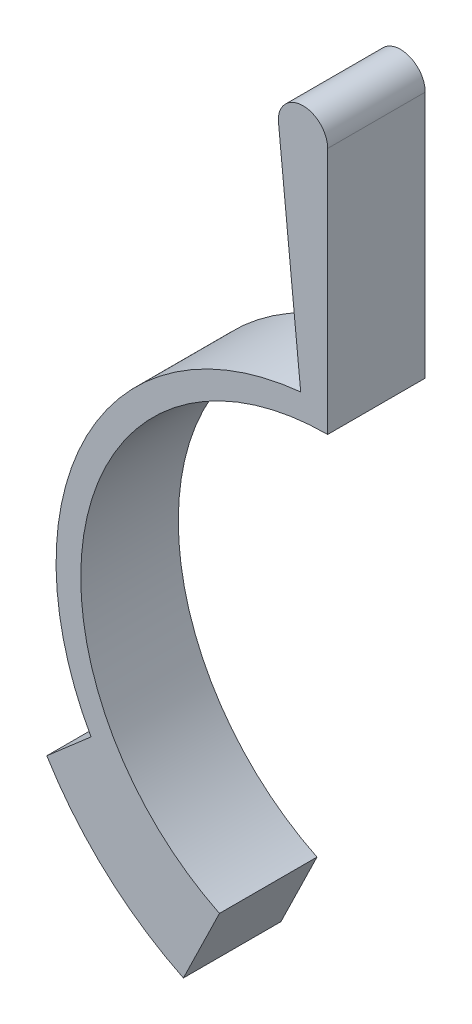
ISO-10303-21;
HEADER;
FILE_DESCRIPTION(('STEP AP214'),'2;1');
FILE_NAME('part.step','',(''),(''),'','','');
FILE_SCHEMA(('AUTOMOTIVE_DESIGN { 1 0 10303 214 1 1 1 1 }'));
ENDSEC;
DATA;
#1=APPLICATION_CONTEXT('core data for automotive mechanical design processes');
#2=APPLICATION_PROTOCOL_DEFINITION('international standard','automotive_design',2000,#1);
#3=PRODUCT_CONTEXT('',#1,'mechanical');
#4=PRODUCT('Part','Part','',(#3));
#5=PRODUCT_RELATED_PRODUCT_CATEGORY('part','',(#4));
#6=PRODUCT_DEFINITION_FORMATION('','',#4);
#7=PRODUCT_DEFINITION_CONTEXT('part definition',#1,'design');
#8=PRODUCT_DEFINITION('design','',#6,#7);
#9=PRODUCT_DEFINITION_SHAPE('','',#8);
#10=(LENGTH_UNIT() NAMED_UNIT(*) SI_UNIT(.MILLI.,.METRE.));
#11=(NAMED_UNIT(*) PLANE_ANGLE_UNIT() SI_UNIT($,.RADIAN.));
#12=(NAMED_UNIT(*) SI_UNIT($,.STERADIAN.) SOLID_ANGLE_UNIT());
#13=UNCERTAINTY_MEASURE_WITH_UNIT(LENGTH_MEASURE(1.E-05),#10,'distance_accuracy_value','');
#14=(GEOMETRIC_REPRESENTATION_CONTEXT(3) GLOBAL_UNCERTAINTY_ASSIGNED_CONTEXT((#13)) GLOBAL_UNIT_ASSIGNED_CONTEXT((#10,
#11,#12)) REPRESENTATION_CONTEXT('',''));
#15=CARTESIAN_POINT('',(0.,0.,0.));
#16=DIRECTION('',(0.,0.,1.));
#17=DIRECTION('',(1.,0.,0.));
#18=AXIS2_PLACEMENT_3D('',#15,#16,#17);
#19=CARTESIAN_POINT('',(16.86639311734,-19.3883585742063,11.8499767747553));
#20=DIRECTION('',(-0.656332722816929,0.754471574653224,0.));
#21=DIRECTION('',(-0.754471574653224,-0.65633272281693,0.));
#22=AXIS2_PLACEMENT_3D('',#19,#20,#21);
#23=PLANE('',#22);
#24=DIRECTION('',(0.754471574653224,0.656332722816929,0.));
#25=VECTOR('',#24,1.);
#26=CARTESIAN_POINT('',(16.86639311734,-19.3883585742063,0.));
#27=LINE('',#26,#25);
#28=CARTESIAN_POINT('',(-31.6633817910198,-61.6055611479897,0.));
#29=VERTEX_POINT('',#28);
#30=CARTESIAN_POINT('',(-26.2911877433045,-56.9321620892399,0.));
#31=VERTEX_POINT('',#30);
#32=EDGE_CURVE('E129',#29,#31,#27,.T.);
#33=ORIENTED_EDGE('',*,*,#32,.F.);
#34=DIRECTION('',(0.,0.,-1.));
#35=VECTOR('',#34,1.);
#36=CARTESIAN_POINT('',(-31.6633817910198,-61.6055611479897,11.8499767747553));
#37=LINE('',#36,#35);
#38=CARTESIAN_POINT('',(-31.6633817910198,-61.6055611479897,11.8499767747553));
#39=VERTEX_POINT('',#38);
#40=EDGE_CURVE('E11',#39,#29,#37,.T.);
#41=ORIENTED_EDGE('',*,*,#40,.F.);
#42=DIRECTION('',(0.754471574653224,0.656332722816929,0.));
#43=VECTOR('',#42,1.);
#44=CARTESIAN_POINT('',(16.86639311734,-19.3883585742063,11.8499767747553));
#45=LINE('',#44,#43);
#46=CARTESIAN_POINT('',(-26.2911877433045,-56.9321620892399,11.8499767747553));
#47=VERTEX_POINT('',#46);
#48=EDGE_CURVE('E147',#39,#47,#45,.T.);
#49=ORIENTED_EDGE('',*,*,#48,.T.);
#50=DIRECTION('',(0.,0.,-1.));
#51=VECTOR('',#50,1.);
#52=CARTESIAN_POINT('',(-26.2911877433045,-56.9321620892399,11.8499767747553));
#53=LINE('',#52,#51);
#54=EDGE_CURVE('E84',#47,#31,#53,.T.);
#55=ORIENTED_EDGE('',*,*,#54,.T.);
#56=EDGE_LOOP('',(#33,#41,#49,#55));
#57=FACE_BOUND('',#56,.T.);
#58=ADVANCED_FACE('F34',(#57),#23,.T.);
#59=CARTESIAN_POINT('',(2.46218019296364,-40.7382177790482,11.8499767747553));
#60=DIRECTION('',(0.,0.,-1.));
#61=DIRECTION('',(-1.,0.,0.));
#62=AXIS2_PLACEMENT_3D('',#59,#60,#61);
#63=CYLINDRICAL_SURFACE('',#62,40.0000000000003);
#64=CARTESIAN_POINT('',(2.46218019296364,-40.7382177790482,0.));
#65=DIRECTION('',(0.,0.,1.));
#66=DIRECTION('',(1.,0.,0.));
#67=AXIS2_PLACEMENT_3D('',#64,#65,#66);
#68=CIRCLE('',#67,40.0000000000003);
#69=CARTESIAN_POINT('',(-15.068387214561,-76.6920660622332,0.));
#70=VERTEX_POINT('',#69);
#71=EDGE_CURVE('E132',#29,#70,#68,.T.);
#72=ORIENTED_EDGE('',*,*,#71,.T.);
#73=DIRECTION('',(0.,0.,-1.));
#74=VECTOR('',#73,1.);
#75=CARTESIAN_POINT('',(-15.068387214561,-76.6920660622332,11.8499767747553));
#76=LINE('',#75,#74);
#77=CARTESIAN_POINT('',(-15.068387214561,-76.6920660622332,11.8499767747553));
#78=VERTEX_POINT('',#77);
#79=EDGE_CURVE('E42',#78,#70,#76,.T.);
#80=ORIENTED_EDGE('',*,*,#79,.F.);
#81=CARTESIAN_POINT('',(2.46218019296364,-40.7382177790482,11.8499767747553));
#82=DIRECTION('',(0.,0.,1.));
#83=DIRECTION('',(1.,0.,0.));
#84=AXIS2_PLACEMENT_3D('',#81,#82,#83);
#85=CIRCLE('',#84,40.0000000000003);
#86=EDGE_CURVE('E173',#39,#78,#85,.T.);
#87=ORIENTED_EDGE('',*,*,#86,.F.);
#88=ORIENTED_EDGE('',*,*,#40,.T.);
#89=EDGE_LOOP('',(#72,#80,#87,#88));
#90=FACE_BOUND('',#89,.T.);
#91=ADVANCED_FACE('F177',(#90),#63,.T.);
#92=CARTESIAN_POINT('',(18.0373474136874,-8.79474520218383,11.8499767747553));
#93=DIRECTION('',(-0.898846207079611,0.438264185188109,0.));
#94=DIRECTION('',(-0.438264185188109,-0.898846207079611,0.));
#95=AXIS2_PLACEMENT_3D('',#92,#93,#94);
#96=PLANE('',#95);
#97=DIRECTION('',(0.438264185188109,0.898846207079611,0.));
#98=VECTOR('',#97,1.);
#99=CARTESIAN_POINT('',(18.0373474136874,-8.79474520218383,0.));
#100=LINE('',#99,#98);
#101=CARTESIAN_POINT('',(-10.6857453626796,-67.7036039914366,0.));
#102=VERTEX_POINT('',#101);
#103=EDGE_CURVE('E134',#70,#102,#100,.T.);
#104=ORIENTED_EDGE('',*,*,#103,.T.);
#105=DIRECTION('',(0.,0.,-1.));
#106=VECTOR('',#105,1.);
#107=CARTESIAN_POINT('',(-10.6857453626796,-67.7036039914366,11.8499767747553));
#108=LINE('',#107,#106);
#109=CARTESIAN_POINT('',(-10.6857453626796,-67.7036039914366,11.8499767747553));
#110=VERTEX_POINT('',#109);
#111=EDGE_CURVE('E153',#110,#102,#108,.T.);
#112=ORIENTED_EDGE('',*,*,#111,.F.);
#113=DIRECTION('',(0.438264185188109,0.898846207079611,0.));
#114=VECTOR('',#113,1.);
#115=CARTESIAN_POINT('',(18.0373474136874,-8.79474520218383,11.8499767747553));
#116=LINE('',#115,#114);
#117=EDGE_CURVE('E161',#78,#110,#116,.T.);
#118=ORIENTED_EDGE('',*,*,#117,.F.);
#119=ORIENTED_EDGE('',*,*,#79,.T.);
#120=EDGE_LOOP('',(#104,#112,#118,#119));
#121=FACE_BOUND('',#120,.T.);
#122=ADVANCED_FACE('F159',(#121),#96,.F.);
#123=CARTESIAN_POINT('',(2.46218019296364,-40.7382177790482,11.8499767747553));
#124=DIRECTION('',(0.,0.,-1.));
#125=DIRECTION('',(-1.,0.,0.));
#126=AXIS2_PLACEMENT_3D('',#123,#124,#125);
#127=CYLINDRICAL_SURFACE('',#126,30.);
#128=CARTESIAN_POINT('',(2.46218019296364,-40.7382177790482,0.));
#129=DIRECTION('',(0.,0.,1.));
#130=DIRECTION('',(1.,0.,0.));
#131=AXIS2_PLACEMENT_3D('',#128,#129,#130);
#132=CIRCLE('',#131,30.);
#133=CARTESIAN_POINT('',(2.46218019296364,-10.7382177790482,0.));
#134=VERTEX_POINT('',#133);
#135=EDGE_CURVE('E137',#134,#102,#132,.T.);
#136=ORIENTED_EDGE('',*,*,#135,.F.);
#137=DIRECTION('',(0.,0.,-1.));
#138=VECTOR('',#137,1.);
#139=CARTESIAN_POINT('',(2.46218019296364,-10.7382177790482,11.8499767747553));
#140=LINE('',#139,#138);
#141=CARTESIAN_POINT('',(2.46218019296364,-10.7382177790482,11.8499767747553));
#142=VERTEX_POINT('',#141);
#143=EDGE_CURVE('E151',#142,#134,#140,.T.);
#144=ORIENTED_EDGE('',*,*,#143,.F.);
#145=CARTESIAN_POINT('',(2.46218019296364,-40.7382177790482,11.8499767747553));
#146=DIRECTION('',(0.,0.,1.));
#147=DIRECTION('',(1.,0.,0.));
#148=AXIS2_PLACEMENT_3D('',#145,#146,#147);
#149=CIRCLE('',#148,30.);
#150=EDGE_CURVE('E171',#142,#110,#149,.T.);
#151=ORIENTED_EDGE('',*,*,#150,.T.);
#152=ORIENTED_EDGE('',*,*,#111,.T.);
#153=EDGE_LOOP('',(#136,#144,#151,#152));
#154=FACE_BOUND('',#153,.T.);
#155=ADVANCED_FACE('F169',(#154),#127,.F.);
#156=CARTESIAN_POINT('',(2.46218019296335,0.,11.8499767747553));
#157=DIRECTION('',(-1.,0.,0.));
#158=DIRECTION('',(0.,-1.,0.));
#159=AXIS2_PLACEMENT_3D('',#156,#157,#158);
#160=PLANE('',#159);
#161=DIRECTION('',(0.,1.,0.));
#162=VECTOR('',#161,1.);
#163=CARTESIAN_POINT('',(2.46218019296335,0.,0.));
#164=LINE('',#163,#162);
#165=CARTESIAN_POINT('',(2.46218019296337,19.3607530647324,0.));
#166=VERTEX_POINT('',#165);
#167=EDGE_CURVE('E140',#134,#166,#164,.T.);
#168=ORIENTED_EDGE('',*,*,#167,.T.);
#169=DIRECTION('',(0.,0.,-1.));
#170=VECTOR('',#169,1.);
#171=CARTESIAN_POINT('',(2.46218019296337,19.3607530647324,11.8499767747553));
#172=LINE('',#171,#170);
#173=CARTESIAN_POINT('',(2.46218019296337,19.3607530647324,11.8499767747553));
#174=VERTEX_POINT('',#173);
#175=EDGE_CURVE('E122',#174,#166,#172,.T.);
#176=ORIENTED_EDGE('',*,*,#175,.F.);
#177=DIRECTION('',(0.,1.,0.));
#178=VECTOR('',#177,1.);
#179=CARTESIAN_POINT('',(2.46218019296335,0.,11.8499767747553));
#180=LINE('',#179,#178);
#181=EDGE_CURVE('E109',#142,#174,#180,.T.);
#182=ORIENTED_EDGE('',*,*,#181,.F.);
#183=ORIENTED_EDGE('',*,*,#143,.T.);
#184=EDGE_LOOP('',(#168,#176,#182,#183));
#185=FACE_BOUND('',#184,.T.);
#186=ADVANCED_FACE('F187',(#185),#160,.F.);
#187=CARTESIAN_POINT('',(-0.537819807036631,19.3607530647324,11.8499767747553));
#188=DIRECTION('',(0.,0.,-1.));
#189=DIRECTION('',(-1.,0.,0.));
#190=AXIS2_PLACEMENT_3D('',#187,#188,#189);
#191=CYLINDRICAL_SURFACE('',#190,2.99999999999975);
#192=CARTESIAN_POINT('',(-0.537819807036631,19.3607530647324,0.));
#193=DIRECTION('',(0.,0.,1.));
#194=DIRECTION('',(1.,0.,0.));
#195=AXIS2_PLACEMENT_3D('',#192,#193,#194);
#196=CIRCLE('',#195,2.99999999999975);
#197=CARTESIAN_POINT('',(-3.53781980703663,19.3607530647324,0.));
#198=VERTEX_POINT('',#197);
#199=EDGE_CURVE('E118',#166,#198,#196,.T.);
#200=ORIENTED_EDGE('',*,*,#199,.T.);
#201=DIRECTION('',(0.,0.,-1.));
#202=VECTOR('',#201,1.);
#203=CARTESIAN_POINT('',(-3.53781980703663,19.3607530647324,11.8499767747553));
#204=LINE('',#203,#202);
#205=CARTESIAN_POINT('',(-3.53781980703663,19.3607530647324,11.8499767747553));
#206=VERTEX_POINT('',#205);
#207=EDGE_CURVE('E115',#206,#198,#204,.T.);
#208=ORIENTED_EDGE('',*,*,#207,.F.);
#209=CARTESIAN_POINT('',(-0.537819807036631,19.3607530647324,11.8499767747553));
#210=DIRECTION('',(0.,0.,1.));
#211=DIRECTION('',(1.,0.,0.));
#212=AXIS2_PLACEMENT_3D('',#209,#210,#211);
#213=CIRCLE('',#212,2.99999999999975);
#214=EDGE_CURVE('E102',#174,#206,#213,.T.);
#215=ORIENTED_EDGE('',*,*,#214,.F.);
#216=ORIENTED_EDGE('',*,*,#175,.T.);
#217=EDGE_LOOP('',(#200,#208,#215,#216));
#218=FACE_BOUND('',#217,.T.);
#219=ADVANCED_FACE('F116',(#218),#191,.T.);
#220=CARTESIAN_POINT('',(-1.58909417827915,-0.158647726172253,11.8499767747553));
#221=DIRECTION('',(-0.995053401256278,-0.0993414749654592,0.));
#222=DIRECTION('',(0.0993414749654592,-0.995053401256278,0.));
#223=AXIS2_PLACEMENT_3D('',#220,#221,#222);
#224=PLANE('',#223);
#225=DIRECTION('',(-0.0993414749654592,0.995053401256278,0.));
#226=VECTOR('',#225,1.);
#227=CARTESIAN_POINT('',(-1.58909417827915,-0.158647726172253,0.));
#228=LINE('',#227,#226);
#229=CARTESIAN_POINT('',(-0.816088480907054,-7.90145553759265,0.));
#230=VERTEX_POINT('',#229);
#231=EDGE_CURVE('E143',#230,#198,#228,.T.);
#232=ORIENTED_EDGE('',*,*,#231,.F.);
#233=DIRECTION('',(0.,0.,-1.));
#234=VECTOR('',#233,1.);
#235=CARTESIAN_POINT('',(-0.816088480907054,-7.90145553759265,11.8499767747553));
#236=LINE('',#235,#234);
#237=CARTESIAN_POINT('',(-0.816088480907054,-7.90145553759265,11.8499767747553));
#238=VERTEX_POINT('',#237);
#239=EDGE_CURVE('E77',#238,#230,#236,.T.);
#240=ORIENTED_EDGE('',*,*,#239,.F.);
#241=DIRECTION('',(-0.0993414749654592,0.995053401256278,0.));
#242=VECTOR('',#241,1.);
#243=CARTESIAN_POINT('',(-1.58909417827915,-0.158647726172253,11.8499767747553));
#244=LINE('',#243,#242);
#245=EDGE_CURVE('E106',#238,#206,#244,.T.);
#246=ORIENTED_EDGE('',*,*,#245,.T.);
#247=ORIENTED_EDGE('',*,*,#207,.T.);
#248=EDGE_LOOP('',(#232,#240,#246,#247));
#249=FACE_BOUND('',#248,.T.);
#250=ADVANCED_FACE('F124',(#249),#224,.T.);
#251=CARTESIAN_POINT('',(2.46218019296364,-40.7382177790482,11.8499767747553));
#252=DIRECTION('',(0.,0.,-1.));
#253=DIRECTION('',(-1.,0.,0.));
#254=AXIS2_PLACEMENT_3D('',#251,#252,#253);
#255=CYLINDRICAL_SURFACE('',#254,32.9999999999997);
#256=CARTESIAN_POINT('',(2.46218019296364,-40.7382177790482,0.));
#257=DIRECTION('',(0.,0.,1.));
#258=DIRECTION('',(1.,0.,0.));
#259=AXIS2_PLACEMENT_3D('',#256,#257,#258);
#260=CIRCLE('',#259,32.9999999999997);
#261=EDGE_CURVE('E145',#230,#31,#260,.T.);
#262=ORIENTED_EDGE('',*,*,#261,.T.);
#263=ORIENTED_EDGE('',*,*,#54,.F.);
#264=CARTESIAN_POINT('',(2.46218019296364,-40.7382177790482,11.8499767747553));
#265=DIRECTION('',(0.,0.,1.));
#266=DIRECTION('',(1.,0.,0.));
#267=AXIS2_PLACEMENT_3D('',#264,#265,#266);
#268=CIRCLE('',#267,32.9999999999997);
#269=EDGE_CURVE('E50',#238,#47,#268,.T.);
#270=ORIENTED_EDGE('',*,*,#269,.F.);
#271=ORIENTED_EDGE('',*,*,#239,.T.);
#272=EDGE_LOOP('',(#262,#263,#270,#271));
#273=FACE_BOUND('',#272,.T.);
#274=ADVANCED_FACE('F195',(#273),#255,.T.);
#275=CARTESIAN_POINT('',(0.,0.,11.8499767747553));
#276=DIRECTION('',(0.,0.,1.));
#277=DIRECTION('',(1.,0.,0.));
#278=AXIS2_PLACEMENT_3D('',#275,#276,#277);
#279=PLANE('',#278);
#280=ORIENTED_EDGE('',*,*,#48,.F.);
#281=ORIENTED_EDGE('',*,*,#86,.T.);
#282=ORIENTED_EDGE('',*,*,#117,.T.);
#283=ORIENTED_EDGE('',*,*,#150,.F.);
#284=ORIENTED_EDGE('',*,*,#181,.T.);
#285=ORIENTED_EDGE('',*,*,#214,.T.);
#286=ORIENTED_EDGE('',*,*,#245,.F.);
#287=ORIENTED_EDGE('',*,*,#269,.T.);
#288=EDGE_LOOP('',(#280,#281,#282,#283,#284,#285,#286,#287));
#289=FACE_BOUND('',#288,.T.);
#290=ADVANCED_FACE('F104',(#289),#279,.T.);
#291=CARTESIAN_POINT('',(0.,0.,0.));
#292=DIRECTION('',(0.,0.,1.));
#293=DIRECTION('',(1.,0.,0.));
#294=AXIS2_PLACEMENT_3D('',#291,#292,#293);
#295=PLANE('',#294);
#296=ORIENTED_EDGE('',*,*,#32,.T.);
#297=ORIENTED_EDGE('',*,*,#261,.F.);
#298=ORIENTED_EDGE('',*,*,#231,.T.);
#299=ORIENTED_EDGE('',*,*,#199,.F.);
#300=ORIENTED_EDGE('',*,*,#167,.F.);
#301=ORIENTED_EDGE('',*,*,#135,.T.);
#302=ORIENTED_EDGE('',*,*,#103,.F.);
#303=ORIENTED_EDGE('',*,*,#71,.F.);
#304=EDGE_LOOP('',(#296,#297,#298,#299,#300,#301,#302,#303));
#305=FACE_BOUND('',#304,.T.);
#306=ADVANCED_FACE('F165',(#305),#295,.F.);
#307=CLOSED_SHELL('',(#58,#91,#122,#155,#186,#219,#250,#274,#290,#306));
#308=MANIFOLD_SOLID_BREP('B2',#307);
#309=ADVANCED_BREP_SHAPE_REPRESENTATION('',(#18,#308),#14);
#310=SHAPE_DEFINITION_REPRESENTATION(#9,#309);
ENDSEC;
END-ISO-10303-21;
